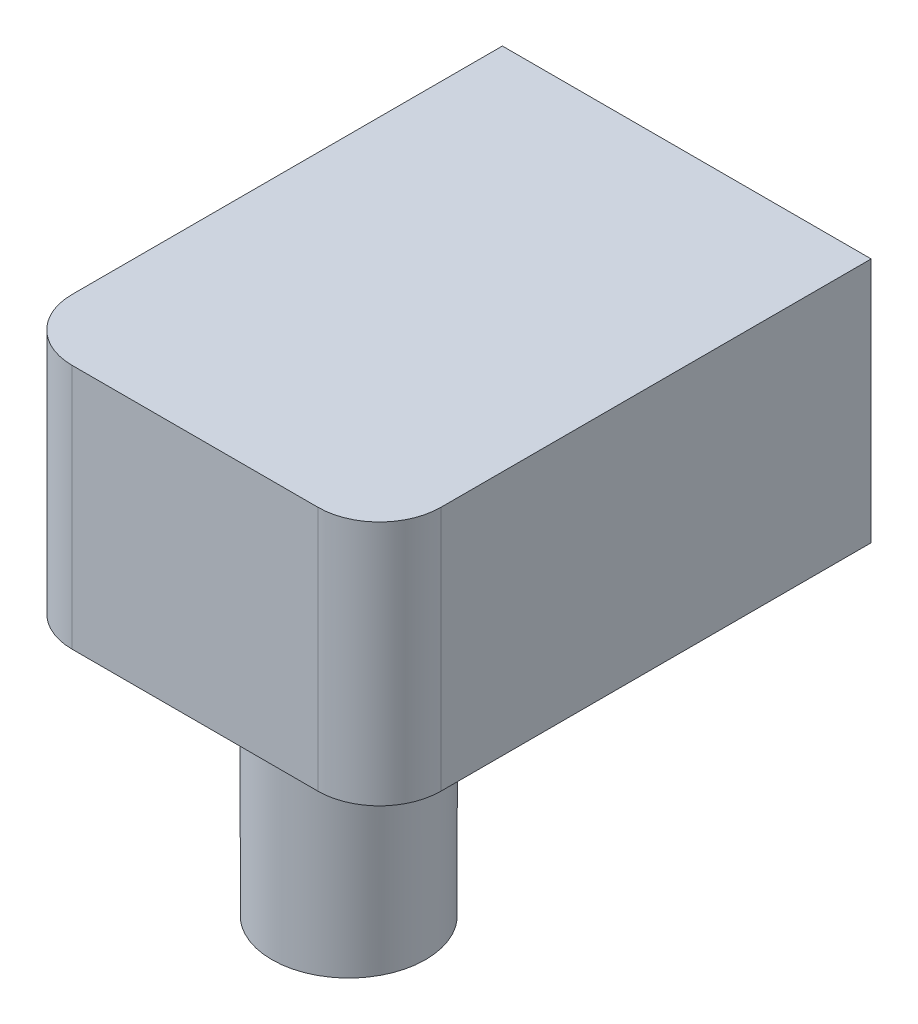
ISO-10303-21;
HEADER;
FILE_DESCRIPTION(('STEP AP214'),'2;1');
FILE_NAME('part.step','',(''),(''),'','','');
FILE_SCHEMA(('AUTOMOTIVE_DESIGN { 1 0 10303 214 1 1 1 1 }'));
ENDSEC;
DATA;
#1=APPLICATION_CONTEXT('core data for automotive mechanical design processes');
#2=APPLICATION_PROTOCOL_DEFINITION('international standard','automotive_design',2000,#1);
#3=PRODUCT_CONTEXT('',#1,'mechanical');
#4=PRODUCT('Part','Part','',(#3));
#5=PRODUCT_RELATED_PRODUCT_CATEGORY('part','',(#4));
#6=PRODUCT_DEFINITION_FORMATION('','',#4);
#7=PRODUCT_DEFINITION_CONTEXT('part definition',#1,'design');
#8=PRODUCT_DEFINITION('design','',#6,#7);
#9=PRODUCT_DEFINITION_SHAPE('','',#8);
#10=(LENGTH_UNIT() NAMED_UNIT(*) SI_UNIT(.MILLI.,.METRE.));
#11=(NAMED_UNIT(*) PLANE_ANGLE_UNIT() SI_UNIT($,.RADIAN.));
#12=(NAMED_UNIT(*) SI_UNIT($,.STERADIAN.) SOLID_ANGLE_UNIT());
#13=UNCERTAINTY_MEASURE_WITH_UNIT(LENGTH_MEASURE(1.E-05),#10,'distance_accuracy_value','');
#14=(GEOMETRIC_REPRESENTATION_CONTEXT(3) GLOBAL_UNCERTAINTY_ASSIGNED_CONTEXT((#13)) GLOBAL_UNIT_ASSIGNED_CONTEXT((#10,
#11,#12)) REPRESENTATION_CONTEXT('',''));
#15=CARTESIAN_POINT('',(0.,0.,0.));
#16=DIRECTION('',(0.,0.,1.));
#17=DIRECTION('',(1.,0.,0.));
#18=AXIS2_PLACEMENT_3D('',#15,#16,#17);
#19=CARTESIAN_POINT('',(30.,-20.,80.));
#20=DIRECTION('',(-1.,0.,0.));
#21=DIRECTION('',(0.,0.,1.));
#22=AXIS2_PLACEMENT_3D('',#19,#20,#21);
#23=PLANE('',#22);
#24=DIRECTION('',(0.,0.,-1.));
#25=VECTOR('',#24,1.);
#26=CARTESIAN_POINT('',(30.,20.,80.));
#27=LINE('',#26,#25);
#28=CARTESIAN_POINT('',(30.,20.,70.));
#29=VERTEX_POINT('',#28);
#30=CARTESIAN_POINT('',(30.,20.,0.));
#31=VERTEX_POINT('',#30);
#32=EDGE_CURVE('E86',#29,#31,#27,.T.);
#33=ORIENTED_EDGE('',*,*,#32,.F.);
#34=DIRECTION('',(0.,1.,0.));
#35=VECTOR('',#34,1.);
#36=CARTESIAN_POINT('',(30.,-20.,70.));
#37=LINE('',#36,#35);
#38=CARTESIAN_POINT('',(30.,-20.,70.));
#39=VERTEX_POINT('',#38);
#40=EDGE_CURVE('E56',#29,#39,#37,.F.);
#41=ORIENTED_EDGE('',*,*,#40,.T.);
#42=DIRECTION('',(0.,0.,-1.));
#43=VECTOR('',#42,1.);
#44=CARTESIAN_POINT('',(30.,-20.,80.));
#45=LINE('',#44,#43);
#46=CARTESIAN_POINT('',(30.,-20.,0.));
#47=VERTEX_POINT('',#46);
#48=EDGE_CURVE('E106',#39,#47,#45,.T.);
#49=ORIENTED_EDGE('',*,*,#48,.T.);
#50=DIRECTION('',(0.,1.,0.));
#51=VECTOR('',#50,1.);
#52=CARTESIAN_POINT('',(30.,-20.,0.));
#53=LINE('',#52,#51);
#54=EDGE_CURVE('E102',#47,#31,#53,.T.);
#55=ORIENTED_EDGE('',*,*,#54,.T.);
#56=EDGE_LOOP('',(#33,#41,#49,#55));
#57=FACE_BOUND('',#56,.T.);
#58=ADVANCED_FACE('F33',(#57),#23,.F.);
#59=CARTESIAN_POINT('',(-30.,20.,80.));
#60=DIRECTION('',(0.,-1.,0.));
#61=DIRECTION('',(0.,0.,-1.));
#62=AXIS2_PLACEMENT_3D('',#59,#60,#61);
#63=PLANE('',#62);
#64=DIRECTION('',(-1.,0.,0.));
#65=VECTOR('',#64,1.);
#66=CARTESIAN_POINT('',(-30.,20.,80.));
#67=LINE('',#66,#65);
#68=CARTESIAN_POINT('',(20.,20.,80.));
#69=VERTEX_POINT('',#68);
#70=CARTESIAN_POINT('',(-20.,20.,80.));
#71=VERTEX_POINT('',#70);
#72=EDGE_CURVE('E119',#69,#71,#67,.T.);
#73=ORIENTED_EDGE('',*,*,#72,.F.);
#74=CARTESIAN_POINT('',(20.,20.,70.));
#75=DIRECTION('',(0.,-1.,0.));
#76=DIRECTION('',(0.,0.,-1.));
#77=AXIS2_PLACEMENT_3D('',#74,#75,#76);
#78=CIRCLE('',#77,10.);
#79=EDGE_CURVE('E93',#69,#29,#78,.F.);
#80=ORIENTED_EDGE('',*,*,#79,.T.);
#81=ORIENTED_EDGE('',*,*,#32,.T.);
#82=DIRECTION('',(-1.,0.,0.));
#83=VECTOR('',#82,1.);
#84=CARTESIAN_POINT('',(-30.,20.,0.));
#85=LINE('',#84,#83);
#86=CARTESIAN_POINT('',(-30.,20.,0.));
#87=VERTEX_POINT('',#86);
#88=EDGE_CURVE('E91',#31,#87,#85,.T.);
#89=ORIENTED_EDGE('',*,*,#88,.T.);
#90=DIRECTION('',(0.,0.,-1.));
#91=VECTOR('',#90,1.);
#92=CARTESIAN_POINT('',(-30.,20.,80.));
#93=LINE('',#92,#91);
#94=CARTESIAN_POINT('',(-30.,20.,70.));
#95=VERTEX_POINT('',#94);
#96=EDGE_CURVE('E96',#95,#87,#93,.T.);
#97=ORIENTED_EDGE('',*,*,#96,.F.);
#98=CARTESIAN_POINT('',(-20.,20.,70.));
#99=DIRECTION('',(0.,-1.,0.));
#100=DIRECTION('',(0.,0.,-1.));
#101=AXIS2_PLACEMENT_3D('',#98,#99,#100);
#102=CIRCLE('',#101,10.);
#103=EDGE_CURVE('E129',#95,#71,#102,.F.);
#104=ORIENTED_EDGE('',*,*,#103,.T.);
#105=EDGE_LOOP('',(#73,#80,#81,#89,#97,#104));
#106=FACE_BOUND('',#105,.T.);
#107=ADVANCED_FACE('F89',(#106),#63,.F.);
#108=CARTESIAN_POINT('',(-30.,-20.,80.));
#109=DIRECTION('',(1.,0.,0.));
#110=DIRECTION('',(0.,0.,-1.));
#111=AXIS2_PLACEMENT_3D('',#108,#109,#110);
#112=PLANE('',#111);
#113=DIRECTION('',(0.,0.,-1.));
#114=VECTOR('',#113,1.);
#115=CARTESIAN_POINT('',(-30.,-20.,80.));
#116=LINE('',#115,#114);
#117=CARTESIAN_POINT('',(-30.,-20.,70.));
#118=VERTEX_POINT('',#117);
#119=CARTESIAN_POINT('',(-30.,-20.,0.));
#120=VERTEX_POINT('',#119);
#121=EDGE_CURVE('E121',#118,#120,#116,.T.);
#122=ORIENTED_EDGE('',*,*,#121,.F.);
#123=DIRECTION('',(0.,-1.,0.));
#124=VECTOR('',#123,1.);
#125=CARTESIAN_POINT('',(-30.,-20.,70.));
#126=LINE('',#125,#124);
#127=EDGE_CURVE('E41',#118,#95,#126,.F.);
#128=ORIENTED_EDGE('',*,*,#127,.T.);
#129=ORIENTED_EDGE('',*,*,#96,.T.);
#130=DIRECTION('',(0.,-1.,0.));
#131=VECTOR('',#130,1.);
#132=CARTESIAN_POINT('',(-30.,-20.,0.));
#133=LINE('',#132,#131);
#134=EDGE_CURVE('E104',#87,#120,#133,.T.);
#135=ORIENTED_EDGE('',*,*,#134,.T.);
#136=EDGE_LOOP('',(#122,#128,#129,#135));
#137=FACE_BOUND('',#136,.T.);
#138=ADVANCED_FACE('F137',(#137),#112,.F.);
#139=CARTESIAN_POINT('',(-30.,-20.,80.));
#140=DIRECTION('',(0.,1.,0.));
#141=DIRECTION('',(0.,0.,1.));
#142=AXIS2_PLACEMENT_3D('',#139,#140,#141);
#143=PLANE('',#142);
#144=CARTESIAN_POINT('',(0.,-20.,55.));
#145=DIRECTION('',(0.,1.,0.));
#146=DIRECTION('',(0.,0.,1.));
#147=AXIS2_PLACEMENT_3D('',#144,#145,#146);
#148=CIRCLE('',#147,12.5);
#149=CARTESIAN_POINT('',(0.,-20.,67.5));
#150=VERTEX_POINT('',#149);
#151=EDGE_CURVE('E11',#150,#150,#148,.F.);
#152=ORIENTED_EDGE('',*,*,#151,.F.);
#153=EDGE_LOOP('',(#152));
#154=FACE_BOUND('',#153,.T.);
#155=ORIENTED_EDGE('',*,*,#48,.F.);
#156=CARTESIAN_POINT('',(20.,-20.,70.));
#157=DIRECTION('',(0.,1.,0.));
#158=DIRECTION('',(0.,0.,1.));
#159=AXIS2_PLACEMENT_3D('',#156,#157,#158);
#160=CIRCLE('',#159,10.);
#161=CARTESIAN_POINT('',(20.,-20.,80.));
#162=VERTEX_POINT('',#161);
#163=EDGE_CURVE('E134',#39,#162,#160,.F.);
#164=ORIENTED_EDGE('',*,*,#163,.T.);
#165=DIRECTION('',(1.,0.,0.));
#166=VECTOR('',#165,1.);
#167=CARTESIAN_POINT('',(-30.,-20.,80.));
#168=LINE('',#167,#166);
#169=CARTESIAN_POINT('',(-20.,-20.,80.));
#170=VERTEX_POINT('',#169);
#171=EDGE_CURVE('E113',#170,#162,#168,.T.);
#172=ORIENTED_EDGE('',*,*,#171,.F.);
#173=CARTESIAN_POINT('',(-20.,-20.,70.));
#174=DIRECTION('',(0.,1.,0.));
#175=DIRECTION('',(0.,0.,1.));
#176=AXIS2_PLACEMENT_3D('',#173,#174,#175);
#177=CIRCLE('',#176,10.);
#178=EDGE_CURVE('E48',#170,#118,#177,.F.);
#179=ORIENTED_EDGE('',*,*,#178,.T.);
#180=ORIENTED_EDGE('',*,*,#121,.T.);
#181=DIRECTION('',(1.,0.,0.));
#182=VECTOR('',#181,1.);
#183=CARTESIAN_POINT('',(-30.,-20.,0.));
#184=LINE('',#183,#182);
#185=EDGE_CURVE('E117',#120,#47,#184,.T.);
#186=ORIENTED_EDGE('',*,*,#185,.T.);
#187=EDGE_LOOP('',(#155,#164,#172,#179,#180,#186));
#188=FACE_BOUND('',#187,.T.);
#189=ADVANCED_FACE('F146',(#154,#188),#143,.F.);
#190=CARTESIAN_POINT('',(0.,0.,80.));
#191=DIRECTION('',(0.,0.,-1.));
#192=DIRECTION('',(-1.,0.,0.));
#193=AXIS2_PLACEMENT_3D('',#190,#191,#192);
#194=PLANE('',#193);
#195=ORIENTED_EDGE('',*,*,#171,.T.);
#196=DIRECTION('',(0.,1.,0.));
#197=VECTOR('',#196,1.);
#198=CARTESIAN_POINT('',(20.,0.,80.));
#199=LINE('',#198,#197);
#200=EDGE_CURVE('E126',#162,#69,#199,.T.);
#201=ORIENTED_EDGE('',*,*,#200,.T.);
#202=ORIENTED_EDGE('',*,*,#72,.T.);
#203=DIRECTION('',(0.,-1.,0.));
#204=VECTOR('',#203,1.);
#205=CARTESIAN_POINT('',(-20.,0.,80.));
#206=LINE('',#205,#204);
#207=EDGE_CURVE('E95',#71,#170,#206,.T.);
#208=ORIENTED_EDGE('',*,*,#207,.T.);
#209=EDGE_LOOP('',(#195,#201,#202,#208));
#210=FACE_BOUND('',#209,.T.);
#211=ADVANCED_FACE('F144',(#210),#194,.F.);
#212=CARTESIAN_POINT('',(0.,0.,0.));
#213=DIRECTION('',(0.,0.,-1.));
#214=DIRECTION('',(-1.,0.,0.));
#215=AXIS2_PLACEMENT_3D('',#212,#213,#214);
#216=PLANE('',#215);
#217=ORIENTED_EDGE('',*,*,#54,.F.);
#218=ORIENTED_EDGE('',*,*,#185,.F.);
#219=ORIENTED_EDGE('',*,*,#134,.F.);
#220=ORIENTED_EDGE('',*,*,#88,.F.);
#221=EDGE_LOOP('',(#217,#218,#219,#220));
#222=FACE_BOUND('',#221,.T.);
#223=ADVANCED_FACE('F100',(#222),#216,.T.);
#224=CARTESIAN_POINT('',(20.,0.,70.));
#225=DIRECTION('',(0.,1.,0.));
#226=DIRECTION('',(0.,0.,1.));
#227=AXIS2_PLACEMENT_3D('',#224,#225,#226);
#228=CYLINDRICAL_SURFACE('',#227,10.);
#229=ORIENTED_EDGE('',*,*,#163,.F.);
#230=ORIENTED_EDGE('',*,*,#40,.F.);
#231=ORIENTED_EDGE('',*,*,#79,.F.);
#232=ORIENTED_EDGE('',*,*,#200,.F.);
#233=EDGE_LOOP('',(#229,#230,#231,#232));
#234=FACE_BOUND('',#233,.T.);
#235=ADVANCED_FACE('F149',(#234),#228,.T.);
#236=CARTESIAN_POINT('',(-20.,0.,70.));
#237=DIRECTION('',(0.,-1.,0.));
#238=DIRECTION('',(0.,0.,-1.));
#239=AXIS2_PLACEMENT_3D('',#236,#237,#238);
#240=CYLINDRICAL_SURFACE('',#239,10.);
#241=ORIENTED_EDGE('',*,*,#103,.F.);
#242=ORIENTED_EDGE('',*,*,#127,.F.);
#243=ORIENTED_EDGE('',*,*,#178,.F.);
#244=ORIENTED_EDGE('',*,*,#207,.F.);
#245=EDGE_LOOP('',(#241,#242,#243,#244));
#246=FACE_BOUND('',#245,.T.);
#247=ADVANCED_FACE('F35',(#246),#240,.T.);
#248=CARTESIAN_POINT('',(0.,-60.,55.));
#249=DIRECTION('',(0.,1.,0.));
#250=DIRECTION('',(0.,0.,1.));
#251=AXIS2_PLACEMENT_3D('',#248,#249,#250);
#252=CYLINDRICAL_SURFACE('',#251,12.5);
#253=CARTESIAN_POINT('',(0.,-60.,55.));
#254=DIRECTION('',(0.,-1.,0.));
#255=DIRECTION('',(0.,0.,-1.));
#256=AXIS2_PLACEMENT_3D('',#253,#254,#255);
#257=CIRCLE('',#256,12.5);
#258=CARTESIAN_POINT('',(0.,-60.,42.5));
#259=VERTEX_POINT('',#258);
#260=EDGE_CURVE('E108',#259,#259,#257,.T.);
#261=ORIENTED_EDGE('',*,*,#260,.F.);
#262=EDGE_LOOP('',(#261));
#263=FACE_BOUND('',#262,.T.);
#264=ORIENTED_EDGE('',*,*,#151,.T.);
#265=EDGE_LOOP('',(#264));
#266=FACE_BOUND('',#265,.T.);
#267=ADVANCED_FACE('F155',(#263,#266),#252,.T.);
#268=CARTESIAN_POINT('',(0.,-60.,55.));
#269=DIRECTION('',(0.,-1.,0.));
#270=DIRECTION('',(0.,0.,-1.));
#271=AXIS2_PLACEMENT_3D('',#268,#269,#270);
#272=PLANE('',#271);
#273=ORIENTED_EDGE('',*,*,#260,.T.);
#274=EDGE_LOOP('',(#273));
#275=FACE_BOUND('',#274,.T.);
#276=ADVANCED_FACE('F173',(#275),#272,.T.);
#277=CLOSED_SHELL('',(#58,#107,#138,#189,#211,#223,#235,#247,#267,#276));
#278=MANIFOLD_SOLID_BREP('B2',#277);
#279=ADVANCED_BREP_SHAPE_REPRESENTATION('',(#18,#278),#14);
#280=SHAPE_DEFINITION_REPRESENTATION(#9,#279);
ENDSEC;
END-ISO-10303-21;
